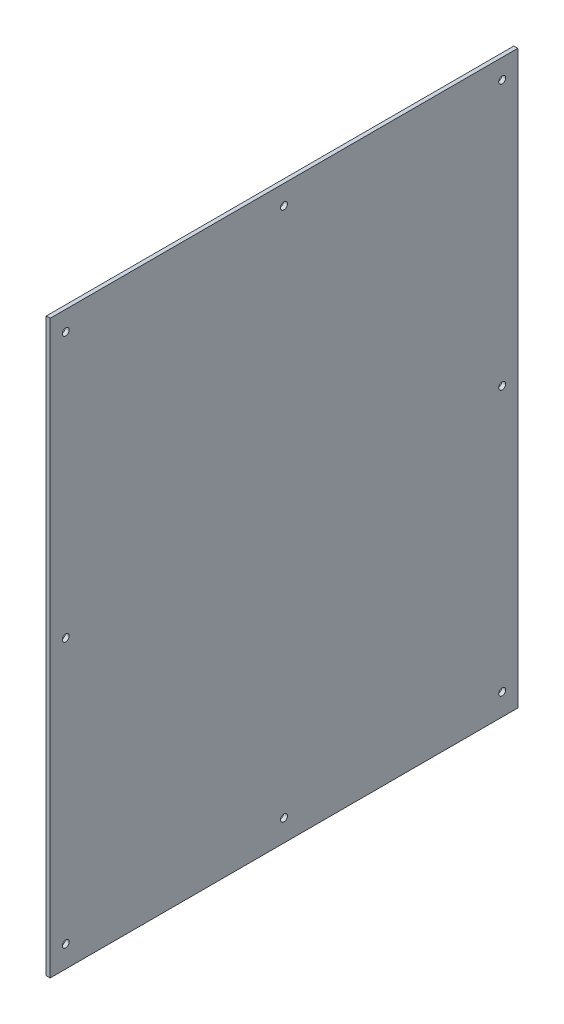
ISO-10303-21;
HEADER;
FILE_DESCRIPTION(('STEP AP214'),'2;1');
FILE_NAME('part.step','',(''),(''),'','','');
FILE_SCHEMA(('AUTOMOTIVE_DESIGN { 1 0 10303 214 1 1 1 1 }'));
ENDSEC;
DATA;
#1=APPLICATION_CONTEXT('core data for automotive mechanical design processes');
#2=APPLICATION_PROTOCOL_DEFINITION('international standard','automotive_design',2000,#1);
#3=PRODUCT_CONTEXT('',#1,'mechanical');
#4=PRODUCT('Part','Part','',(#3));
#5=PRODUCT_RELATED_PRODUCT_CATEGORY('part','',(#4));
#6=PRODUCT_DEFINITION_FORMATION('','',#4);
#7=PRODUCT_DEFINITION_CONTEXT('part definition',#1,'design');
#8=PRODUCT_DEFINITION('design','',#6,#7);
#9=PRODUCT_DEFINITION_SHAPE('','',#8);
#10=(LENGTH_UNIT() NAMED_UNIT(*) SI_UNIT(.MILLI.,.METRE.));
#11=(NAMED_UNIT(*) PLANE_ANGLE_UNIT() SI_UNIT($,.RADIAN.));
#12=(NAMED_UNIT(*) SI_UNIT($,.STERADIAN.) SOLID_ANGLE_UNIT());
#13=UNCERTAINTY_MEASURE_WITH_UNIT(LENGTH_MEASURE(1.E-05),#10,'distance_accuracy_value','');
#14=(GEOMETRIC_REPRESENTATION_CONTEXT(3) GLOBAL_UNCERTAINTY_ASSIGNED_CONTEXT((#13)) GLOBAL_UNIT_ASSIGNED_CONTEXT((#10,
#11,#12)) REPRESENTATION_CONTEXT('',''));
#15=CARTESIAN_POINT('',(0.,0.,0.));
#16=DIRECTION('',(0.,0.,1.));
#17=DIRECTION('',(1.,0.,0.));
#18=AXIS2_PLACEMENT_3D('',#15,#16,#17);
#19=CARTESIAN_POINT('',(3.175,0.,187.5));
#20=DIRECTION('',(0.,0.,-1.));
#21=DIRECTION('',(-1.,0.,0.));
#22=AXIS2_PLACEMENT_3D('',#19,#20,#21);
#23=PLANE('',#22);
#24=DIRECTION('',(0.,-1.,0.));
#25=VECTOR('',#24,1.);
#26=CARTESIAN_POINT('',(0.,0.,187.5));
#27=LINE('',#26,#25);
#28=CARTESIAN_POINT('',(0.,228.175,187.5));
#29=VERTEX_POINT('',#28);
#30=CARTESIAN_POINT('',(0.,-230.,187.5));
#31=VERTEX_POINT('',#30);
#32=EDGE_CURVE('E147',#29,#31,#27,.T.);
#33=ORIENTED_EDGE('',*,*,#32,.T.);
#34=DIRECTION('',(-1.,0.,0.));
#35=VECTOR('',#34,1.);
#36=CARTESIAN_POINT('',(3.175,-230.,187.5));
#37=LINE('',#36,#35);
#38=CARTESIAN_POINT('',(3.175,-230.,187.5));
#39=VERTEX_POINT('',#38);
#40=EDGE_CURVE('E11',#39,#31,#37,.T.);
#41=ORIENTED_EDGE('',*,*,#40,.F.);
#42=DIRECTION('',(0.,-1.,0.));
#43=VECTOR('',#42,1.);
#44=CARTESIAN_POINT('',(3.175,0.,187.5));
#45=LINE('',#44,#43);
#46=CARTESIAN_POINT('',(3.175,228.175,187.5));
#47=VERTEX_POINT('',#46);
#48=EDGE_CURVE('E96',#47,#39,#45,.T.);
#49=ORIENTED_EDGE('',*,*,#48,.F.);
#50=DIRECTION('',(-1.,0.,0.));
#51=VECTOR('',#50,1.);
#52=CARTESIAN_POINT('',(3.175,228.175,187.5));
#53=LINE('',#52,#51);
#54=EDGE_CURVE('E146',#47,#29,#53,.T.);
#55=ORIENTED_EDGE('',*,*,#54,.T.);
#56=EDGE_LOOP('',(#33,#41,#49,#55));
#57=FACE_BOUND('',#56,.T.);
#58=ADVANCED_FACE('F47',(#57),#23,.F.);
#59=CARTESIAN_POINT('',(3.175,-230.,0.));
#60=DIRECTION('',(0.,1.,0.));
#61=DIRECTION('',(0.,0.,1.));
#62=AXIS2_PLACEMENT_3D('',#59,#60,#61);
#63=PLANE('',#62);
#64=DIRECTION('',(0.,0.,-1.));
#65=VECTOR('',#64,1.);
#66=CARTESIAN_POINT('',(0.,-230.,0.));
#67=LINE('',#66,#65);
#68=CARTESIAN_POINT('',(0.,-230.,-187.5));
#69=VERTEX_POINT('',#68);
#70=EDGE_CURVE('E102',#31,#69,#67,.T.);
#71=ORIENTED_EDGE('',*,*,#70,.T.);
#72=DIRECTION('',(-1.,0.,0.));
#73=VECTOR('',#72,1.);
#74=CARTESIAN_POINT('',(3.175,-230.,-187.5));
#75=LINE('',#74,#73);
#76=CARTESIAN_POINT('',(3.175,-230.,-187.5));
#77=VERTEX_POINT('',#76);
#78=EDGE_CURVE('E56',#77,#69,#75,.T.);
#79=ORIENTED_EDGE('',*,*,#78,.F.);
#80=DIRECTION('',(0.,0.,-1.));
#81=VECTOR('',#80,1.);
#82=CARTESIAN_POINT('',(3.175,-230.,0.));
#83=LINE('',#82,#81);
#84=EDGE_CURVE('E90',#39,#77,#83,.T.);
#85=ORIENTED_EDGE('',*,*,#84,.F.);
#86=ORIENTED_EDGE('',*,*,#40,.T.);
#87=EDGE_LOOP('',(#71,#79,#85,#86));
#88=FACE_BOUND('',#87,.T.);
#89=ADVANCED_FACE('F101',(#88),#63,.F.);
#90=CARTESIAN_POINT('',(3.175,0.,-187.5));
#91=DIRECTION('',(0.,0.,-1.));
#92=DIRECTION('',(-1.,0.,0.));
#93=AXIS2_PLACEMENT_3D('',#90,#91,#92);
#94=PLANE('',#93);
#95=DIRECTION('',(0.,-1.,0.));
#96=VECTOR('',#95,1.);
#97=CARTESIAN_POINT('',(0.,0.,-187.5));
#98=LINE('',#97,#96);
#99=CARTESIAN_POINT('',(0.,228.175,-187.5));
#100=VERTEX_POINT('',#99);
#101=EDGE_CURVE('E153',#100,#69,#98,.T.);
#102=ORIENTED_EDGE('',*,*,#101,.F.);
#103=DIRECTION('',(-1.,0.,0.));
#104=VECTOR('',#103,1.);
#105=CARTESIAN_POINT('',(3.175,228.175,-187.5));
#106=LINE('',#105,#104);
#107=CARTESIAN_POINT('',(3.175,228.175,-187.5));
#108=VERTEX_POINT('',#107);
#109=EDGE_CURVE('E80',#108,#100,#106,.T.);
#110=ORIENTED_EDGE('',*,*,#109,.F.);
#111=DIRECTION('',(0.,-1.,0.));
#112=VECTOR('',#111,1.);
#113=CARTESIAN_POINT('',(3.175,0.,-187.5));
#114=LINE('',#113,#112);
#115=EDGE_CURVE('E94',#108,#77,#114,.T.);
#116=ORIENTED_EDGE('',*,*,#115,.T.);
#117=ORIENTED_EDGE('',*,*,#78,.T.);
#118=EDGE_LOOP('',(#102,#110,#116,#117));
#119=FACE_BOUND('',#118,.T.);
#120=ADVANCED_FACE('F107',(#119),#94,.T.);
#121=CARTESIAN_POINT('',(3.175,212.5,175.));
#122=DIRECTION('',(-1.,0.,0.));
#123=DIRECTION('',(0.,0.,1.));
#124=AXIS2_PLACEMENT_3D('',#121,#122,#123);
#125=CYLINDRICAL_SURFACE('',#124,2.8);
#126=CARTESIAN_POINT('',(3.175,212.5,175.));
#127=DIRECTION('',(1.,0.,0.));
#128=DIRECTION('',(0.,0.,-1.));
#129=AXIS2_PLACEMENT_3D('',#126,#127,#128);
#130=CIRCLE('',#129,2.8);
#131=CARTESIAN_POINT('',(3.175,212.5,172.2));
#132=VERTEX_POINT('',#131);
#133=EDGE_CURVE('E138',#132,#132,#130,.T.);
#134=ORIENTED_EDGE('',*,*,#133,.T.);
#135=EDGE_LOOP('',(#134));
#136=FACE_BOUND('',#135,.T.);
#137=CARTESIAN_POINT('',(0.,212.5,175.));
#138=DIRECTION('',(1.,0.,0.));
#139=DIRECTION('',(0.,0.,-1.));
#140=AXIS2_PLACEMENT_3D('',#137,#138,#139);
#141=CIRCLE('',#140,2.8);
#142=CARTESIAN_POINT('',(0.,212.5,172.2));
#143=VERTEX_POINT('',#142);
#144=EDGE_CURVE('E182',#143,#143,#141,.T.);
#145=ORIENTED_EDGE('',*,*,#144,.F.);
#146=EDGE_LOOP('',(#145));
#147=FACE_BOUND('',#146,.T.);
#148=ADVANCED_FACE('F236',(#136,#147),#125,.F.);
#149=CARTESIAN_POINT('',(3.175,212.5,-175.));
#150=DIRECTION('',(-1.,0.,0.));
#151=DIRECTION('',(0.,0.,1.));
#152=AXIS2_PLACEMENT_3D('',#149,#150,#151);
#153=CYLINDRICAL_SURFACE('',#152,2.8);
#154=CARTESIAN_POINT('',(3.175,212.5,-175.));
#155=DIRECTION('',(1.,0.,0.));
#156=DIRECTION('',(0.,0.,-1.));
#157=AXIS2_PLACEMENT_3D('',#154,#155,#156);
#158=CIRCLE('',#157,2.8);
#159=CARTESIAN_POINT('',(3.175,212.5,-177.8));
#160=VERTEX_POINT('',#159);
#161=EDGE_CURVE('E134',#160,#160,#158,.T.);
#162=ORIENTED_EDGE('',*,*,#161,.T.);
#163=EDGE_LOOP('',(#162));
#164=FACE_BOUND('',#163,.T.);
#165=CARTESIAN_POINT('',(0.,212.5,-175.));
#166=DIRECTION('',(1.,0.,0.));
#167=DIRECTION('',(0.,0.,-1.));
#168=AXIS2_PLACEMENT_3D('',#165,#166,#167);
#169=CIRCLE('',#168,2.8);
#170=CARTESIAN_POINT('',(0.,212.5,-177.8));
#171=VERTEX_POINT('',#170);
#172=EDGE_CURVE('E178',#171,#171,#169,.T.);
#173=ORIENTED_EDGE('',*,*,#172,.F.);
#174=EDGE_LOOP('',(#173));
#175=FACE_BOUND('',#174,.T.);
#176=ADVANCED_FACE('F257',(#164,#175),#153,.F.);
#177=CARTESIAN_POINT('',(3.175,-212.5,-175.));
#178=DIRECTION('',(-1.,0.,0.));
#179=DIRECTION('',(0.,0.,1.));
#180=AXIS2_PLACEMENT_3D('',#177,#178,#179);
#181=CYLINDRICAL_SURFACE('',#180,2.8);
#182=CARTESIAN_POINT('',(3.175,-212.5,-175.));
#183=DIRECTION('',(1.,0.,0.));
#184=DIRECTION('',(0.,0.,-1.));
#185=AXIS2_PLACEMENT_3D('',#182,#183,#184);
#186=CIRCLE('',#185,2.8);
#187=CARTESIAN_POINT('',(3.175,-212.5,-177.8));
#188=VERTEX_POINT('',#187);
#189=EDGE_CURVE('E130',#188,#188,#186,.T.);
#190=ORIENTED_EDGE('',*,*,#189,.T.);
#191=EDGE_LOOP('',(#190));
#192=FACE_BOUND('',#191,.T.);
#193=CARTESIAN_POINT('',(0.,-212.5,-175.));
#194=DIRECTION('',(1.,0.,0.));
#195=DIRECTION('',(0.,0.,-1.));
#196=AXIS2_PLACEMENT_3D('',#193,#194,#195);
#197=CIRCLE('',#196,2.8);
#198=CARTESIAN_POINT('',(0.,-212.5,-177.8));
#199=VERTEX_POINT('',#198);
#200=EDGE_CURVE('E174',#199,#199,#197,.T.);
#201=ORIENTED_EDGE('',*,*,#200,.F.);
#202=EDGE_LOOP('',(#201));
#203=FACE_BOUND('',#202,.T.);
#204=ADVANCED_FACE('F253',(#192,#203),#181,.F.);
#205=CARTESIAN_POINT('',(3.175,0.,-175.));
#206=DIRECTION('',(-1.,0.,0.));
#207=DIRECTION('',(0.,0.,1.));
#208=AXIS2_PLACEMENT_3D('',#205,#206,#207);
#209=CYLINDRICAL_SURFACE('',#208,2.8);
#210=CARTESIAN_POINT('',(3.175,0.,-175.));
#211=DIRECTION('',(1.,0.,0.));
#212=DIRECTION('',(0.,0.,-1.));
#213=AXIS2_PLACEMENT_3D('',#210,#211,#212);
#214=CIRCLE('',#213,2.8);
#215=CARTESIAN_POINT('',(3.175,0.,-177.8));
#216=VERTEX_POINT('',#215);
#217=EDGE_CURVE('E126',#216,#216,#214,.T.);
#218=ORIENTED_EDGE('',*,*,#217,.T.);
#219=EDGE_LOOP('',(#218));
#220=FACE_BOUND('',#219,.T.);
#221=CARTESIAN_POINT('',(0.,0.,-175.));
#222=DIRECTION('',(1.,0.,0.));
#223=DIRECTION('',(0.,0.,-1.));
#224=AXIS2_PLACEMENT_3D('',#221,#222,#223);
#225=CIRCLE('',#224,2.8);
#226=CARTESIAN_POINT('',(0.,0.,-177.8));
#227=VERTEX_POINT('',#226);
#228=EDGE_CURVE('E170',#227,#227,#225,.T.);
#229=ORIENTED_EDGE('',*,*,#228,.F.);
#230=EDGE_LOOP('',(#229));
#231=FACE_BOUND('',#230,.T.);
#232=ADVANCED_FACE('F249',(#220,#231),#209,.F.);
#233=CARTESIAN_POINT('',(3.175,0.,175.));
#234=DIRECTION('',(-1.,0.,0.));
#235=DIRECTION('',(0.,0.,1.));
#236=AXIS2_PLACEMENT_3D('',#233,#234,#235);
#237=CYLINDRICAL_SURFACE('',#236,2.8);
#238=CARTESIAN_POINT('',(3.175,0.,175.));
#239=DIRECTION('',(1.,0.,0.));
#240=DIRECTION('',(0.,0.,-1.));
#241=AXIS2_PLACEMENT_3D('',#238,#239,#240);
#242=CIRCLE('',#241,2.8);
#243=CARTESIAN_POINT('',(3.175,0.,172.2));
#244=VERTEX_POINT('',#243);
#245=EDGE_CURVE('E122',#244,#244,#242,.T.);
#246=ORIENTED_EDGE('',*,*,#245,.T.);
#247=EDGE_LOOP('',(#246));
#248=FACE_BOUND('',#247,.T.);
#249=CARTESIAN_POINT('',(0.,0.,175.));
#250=DIRECTION('',(1.,0.,0.));
#251=DIRECTION('',(0.,0.,-1.));
#252=AXIS2_PLACEMENT_3D('',#249,#250,#251);
#253=CIRCLE('',#252,2.8);
#254=CARTESIAN_POINT('',(0.,0.,172.2));
#255=VERTEX_POINT('',#254);
#256=EDGE_CURVE('E166',#255,#255,#253,.T.);
#257=ORIENTED_EDGE('',*,*,#256,.F.);
#258=EDGE_LOOP('',(#257));
#259=FACE_BOUND('',#258,.T.);
#260=ADVANCED_FACE('F245',(#248,#259),#237,.F.);
#261=CARTESIAN_POINT('',(3.175,212.5,0.));
#262=DIRECTION('',(-1.,0.,0.));
#263=DIRECTION('',(0.,0.,1.));
#264=AXIS2_PLACEMENT_3D('',#261,#262,#263);
#265=CYLINDRICAL_SURFACE('',#264,2.80000000000001);
#266=CARTESIAN_POINT('',(3.175,212.5,0.));
#267=DIRECTION('',(1.,0.,0.));
#268=DIRECTION('',(0.,0.,-1.));
#269=AXIS2_PLACEMENT_3D('',#266,#267,#268);
#270=CIRCLE('',#269,2.80000000000001);
#271=CARTESIAN_POINT('',(3.175,212.5,-2.80000000000006));
#272=VERTEX_POINT('',#271);
#273=EDGE_CURVE('E118',#272,#272,#270,.T.);
#274=ORIENTED_EDGE('',*,*,#273,.T.);
#275=EDGE_LOOP('',(#274));
#276=FACE_BOUND('',#275,.T.);
#277=CARTESIAN_POINT('',(0.,212.5,0.));
#278=DIRECTION('',(1.,0.,0.));
#279=DIRECTION('',(0.,0.,-1.));
#280=AXIS2_PLACEMENT_3D('',#277,#278,#279);
#281=CIRCLE('',#280,2.80000000000001);
#282=CARTESIAN_POINT('',(0.,212.5,-2.80000000000006));
#283=VERTEX_POINT('',#282);
#284=EDGE_CURVE('E162',#283,#283,#281,.T.);
#285=ORIENTED_EDGE('',*,*,#284,.F.);
#286=EDGE_LOOP('',(#285));
#287=FACE_BOUND('',#286,.T.);
#288=ADVANCED_FACE('F241',(#276,#287),#265,.F.);
#289=CARTESIAN_POINT('',(3.175,-212.5,0.));
#290=DIRECTION('',(-1.,0.,0.));
#291=DIRECTION('',(0.,0.,1.));
#292=AXIS2_PLACEMENT_3D('',#289,#290,#291);
#293=CYLINDRICAL_SURFACE('',#292,2.80000000000001);
#294=CARTESIAN_POINT('',(3.175,-212.5,0.));
#295=DIRECTION('',(1.,0.,0.));
#296=DIRECTION('',(0.,0.,-1.));
#297=AXIS2_PLACEMENT_3D('',#294,#295,#296);
#298=CIRCLE('',#297,2.80000000000001);
#299=CARTESIAN_POINT('',(3.175,-212.5,-2.80000000000006));
#300=VERTEX_POINT('',#299);
#301=EDGE_CURVE('E111',#300,#300,#298,.T.);
#302=ORIENTED_EDGE('',*,*,#301,.T.);
#303=EDGE_LOOP('',(#302));
#304=FACE_BOUND('',#303,.T.);
#305=CARTESIAN_POINT('',(0.,-212.5,0.));
#306=DIRECTION('',(1.,0.,0.));
#307=DIRECTION('',(0.,0.,-1.));
#308=AXIS2_PLACEMENT_3D('',#305,#306,#307);
#309=CIRCLE('',#308,2.80000000000001);
#310=CARTESIAN_POINT('',(0.,-212.5,-2.80000000000006));
#311=VERTEX_POINT('',#310);
#312=EDGE_CURVE('E158',#311,#311,#309,.T.);
#313=ORIENTED_EDGE('',*,*,#312,.F.);
#314=EDGE_LOOP('',(#313));
#315=FACE_BOUND('',#314,.T.);
#316=ADVANCED_FACE('F226',(#304,#315),#293,.F.);
#317=CARTESIAN_POINT('',(3.175,228.175,0.));
#318=DIRECTION('',(0.,-1.,0.));
#319=DIRECTION('',(0.,0.,-1.));
#320=AXIS2_PLACEMENT_3D('',#317,#318,#319);
#321=PLANE('',#320);
#322=DIRECTION('',(0.,0.,1.));
#323=VECTOR('',#322,1.);
#324=CARTESIAN_POINT('',(0.,228.175,0.));
#325=LINE('',#324,#323);
#326=EDGE_CURVE('E83',#100,#29,#325,.T.);
#327=ORIENTED_EDGE('',*,*,#326,.T.);
#328=ORIENTED_EDGE('',*,*,#54,.F.);
#329=DIRECTION('',(0.,0.,1.));
#330=VECTOR('',#329,1.);
#331=CARTESIAN_POINT('',(3.175,228.175,0.));
#332=LINE('',#331,#330);
#333=EDGE_CURVE('E64',#108,#47,#332,.T.);
#334=ORIENTED_EDGE('',*,*,#333,.F.);
#335=ORIENTED_EDGE('',*,*,#109,.T.);
#336=EDGE_LOOP('',(#327,#328,#334,#335));
#337=FACE_BOUND('',#336,.T.);
#338=ADVANCED_FACE('F218',(#337),#321,.F.);
#339=CARTESIAN_POINT('',(3.175,-212.5,175.));
#340=DIRECTION('',(-1.,0.,0.));
#341=DIRECTION('',(0.,0.,1.));
#342=AXIS2_PLACEMENT_3D('',#339,#340,#341);
#343=CYLINDRICAL_SURFACE('',#342,2.8);
#344=CARTESIAN_POINT('',(3.175,-212.5,175.));
#345=DIRECTION('',(1.,0.,0.));
#346=DIRECTION('',(0.,0.,-1.));
#347=AXIS2_PLACEMENT_3D('',#344,#345,#346);
#348=CIRCLE('',#347,2.8);
#349=CARTESIAN_POINT('',(3.175,-212.5,172.2));
#350=VERTEX_POINT('',#349);
#351=EDGE_CURVE('E142',#350,#350,#348,.T.);
#352=ORIENTED_EDGE('',*,*,#351,.T.);
#353=EDGE_LOOP('',(#352));
#354=FACE_BOUND('',#353,.T.);
#355=CARTESIAN_POINT('',(0.,-212.5,175.));
#356=DIRECTION('',(1.,0.,0.));
#357=DIRECTION('',(0.,0.,-1.));
#358=AXIS2_PLACEMENT_3D('',#355,#356,#357);
#359=CIRCLE('',#358,2.8);
#360=CARTESIAN_POINT('',(0.,-212.5,172.2));
#361=VERTEX_POINT('',#360);
#362=EDGE_CURVE('E186',#361,#361,#359,.T.);
#363=ORIENTED_EDGE('',*,*,#362,.F.);
#364=EDGE_LOOP('',(#363));
#365=FACE_BOUND('',#364,.T.);
#366=ADVANCED_FACE('F216',(#354,#365),#343,.F.);
#367=CARTESIAN_POINT('',(3.175,0.,0.));
#368=DIRECTION('',(1.,0.,0.));
#369=DIRECTION('',(0.,0.,-1.));
#370=AXIS2_PLACEMENT_3D('',#367,#368,#369);
#371=PLANE('',#370);
#372=ORIENTED_EDGE('',*,*,#48,.T.);
#373=ORIENTED_EDGE('',*,*,#84,.T.);
#374=ORIENTED_EDGE('',*,*,#115,.F.);
#375=ORIENTED_EDGE('',*,*,#333,.T.);
#376=EDGE_LOOP('',(#372,#373,#374,#375));
#377=FACE_BOUND('',#376,.T.);
#378=ORIENTED_EDGE('',*,*,#301,.F.);
#379=EDGE_LOOP('',(#378));
#380=FACE_BOUND('',#379,.T.);
#381=ORIENTED_EDGE('',*,*,#273,.F.);
#382=EDGE_LOOP('',(#381));
#383=FACE_BOUND('',#382,.T.);
#384=ORIENTED_EDGE('',*,*,#245,.F.);
#385=EDGE_LOOP('',(#384));
#386=FACE_BOUND('',#385,.T.);
#387=ORIENTED_EDGE('',*,*,#217,.F.);
#388=EDGE_LOOP('',(#387));
#389=FACE_BOUND('',#388,.T.);
#390=ORIENTED_EDGE('',*,*,#189,.F.);
#391=EDGE_LOOP('',(#390));
#392=FACE_BOUND('',#391,.T.);
#393=ORIENTED_EDGE('',*,*,#161,.F.);
#394=EDGE_LOOP('',(#393));
#395=FACE_BOUND('',#394,.T.);
#396=ORIENTED_EDGE('',*,*,#133,.F.);
#397=EDGE_LOOP('',(#396));
#398=FACE_BOUND('',#397,.T.);
#399=ORIENTED_EDGE('',*,*,#351,.F.);
#400=EDGE_LOOP('',(#399));
#401=FACE_BOUND('',#400,.T.);
#402=ADVANCED_FACE('F91',(#377,#380,#383,#386,#389,#392,#395,#398,#401),#371,.T.);
#403=CARTESIAN_POINT('',(0.,0.,0.));
#404=DIRECTION('',(1.,0.,0.));
#405=DIRECTION('',(0.,0.,-1.));
#406=AXIS2_PLACEMENT_3D('',#403,#404,#405);
#407=PLANE('',#406);
#408=ORIENTED_EDGE('',*,*,#32,.F.);
#409=ORIENTED_EDGE('',*,*,#326,.F.);
#410=ORIENTED_EDGE('',*,*,#101,.T.);
#411=ORIENTED_EDGE('',*,*,#70,.F.);
#412=EDGE_LOOP('',(#408,#409,#410,#411));
#413=FACE_BOUND('',#412,.T.);
#414=ORIENTED_EDGE('',*,*,#312,.T.);
#415=EDGE_LOOP('',(#414));
#416=FACE_BOUND('',#415,.T.);
#417=ORIENTED_EDGE('',*,*,#284,.T.);
#418=EDGE_LOOP('',(#417));
#419=FACE_BOUND('',#418,.T.);
#420=ORIENTED_EDGE('',*,*,#256,.T.);
#421=EDGE_LOOP('',(#420));
#422=FACE_BOUND('',#421,.T.);
#423=ORIENTED_EDGE('',*,*,#228,.T.);
#424=EDGE_LOOP('',(#423));
#425=FACE_BOUND('',#424,.T.);
#426=ORIENTED_EDGE('',*,*,#200,.T.);
#427=EDGE_LOOP('',(#426));
#428=FACE_BOUND('',#427,.T.);
#429=ORIENTED_EDGE('',*,*,#172,.T.);
#430=EDGE_LOOP('',(#429));
#431=FACE_BOUND('',#430,.T.);
#432=ORIENTED_EDGE('',*,*,#144,.T.);
#433=EDGE_LOOP('',(#432));
#434=FACE_BOUND('',#433,.T.);
#435=ORIENTED_EDGE('',*,*,#362,.T.);
#436=EDGE_LOOP('',(#435));
#437=FACE_BOUND('',#436,.T.);
#438=ADVANCED_FACE('F196',(#413,#416,#419,#422,#425,#428,#431,#434,#437),#407,.F.);
#439=CLOSED_SHELL('',(#58,#89,#120,#148,#176,#204,#232,#260,#288,#316,#338,#366,#402,#438));
#440=MANIFOLD_SOLID_BREP('B2',#439);
#441=ADVANCED_BREP_SHAPE_REPRESENTATION('',(#18,#440),#14);
#442=SHAPE_DEFINITION_REPRESENTATION(#9,#441);
ENDSEC;
END-ISO-10303-21;
